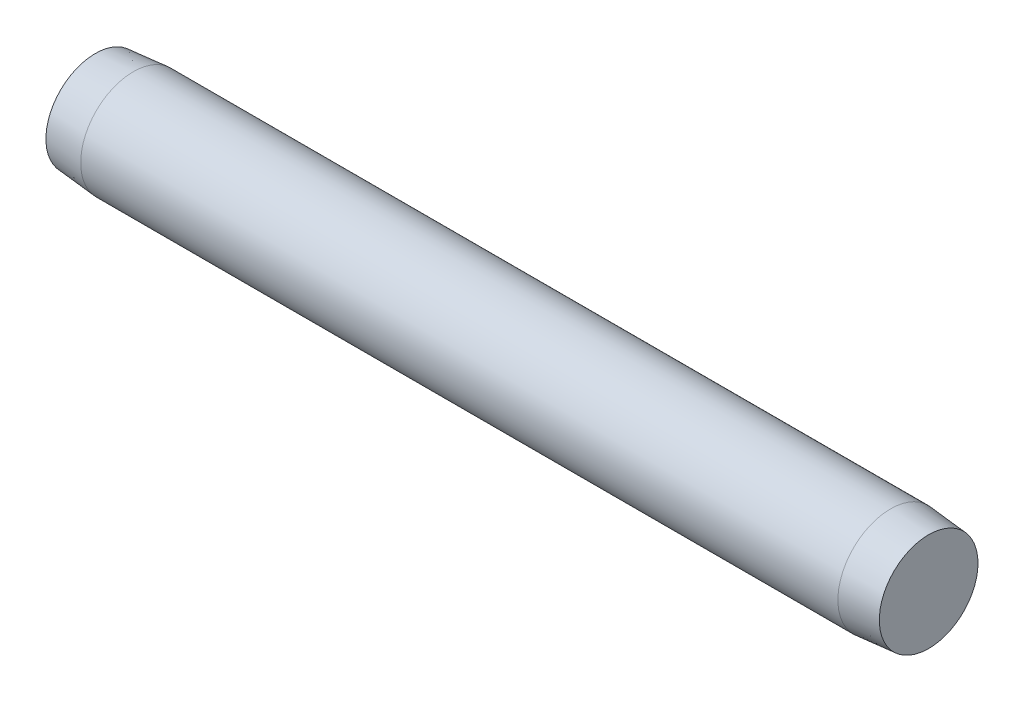
ISO-10303-21;
HEADER;
FILE_DESCRIPTION(('STEP AP214'),'2;1');
FILE_NAME('part.step','',(''),(''),'','','');
FILE_SCHEMA(('AUTOMOTIVE_DESIGN { 1 0 10303 214 1 1 1 1 }'));
ENDSEC;
DATA;
#1=APPLICATION_CONTEXT('core data for automotive mechanical design processes');
#2=APPLICATION_PROTOCOL_DEFINITION('international standard','automotive_design',2000,#1);
#3=PRODUCT_CONTEXT('',#1,'mechanical');
#4=PRODUCT('Part','Part','',(#3));
#5=PRODUCT_RELATED_PRODUCT_CATEGORY('part','',(#4));
#6=PRODUCT_DEFINITION_FORMATION('','',#4);
#7=PRODUCT_DEFINITION_CONTEXT('part definition',#1,'design');
#8=PRODUCT_DEFINITION('design','',#6,#7);
#9=PRODUCT_DEFINITION_SHAPE('','',#8);
#10=(LENGTH_UNIT() NAMED_UNIT(*) SI_UNIT(.MILLI.,.METRE.));
#11=(NAMED_UNIT(*) PLANE_ANGLE_UNIT() SI_UNIT($,.RADIAN.));
#12=(NAMED_UNIT(*) SI_UNIT($,.STERADIAN.) SOLID_ANGLE_UNIT());
#13=UNCERTAINTY_MEASURE_WITH_UNIT(LENGTH_MEASURE(1.E-05),#10,'distance_accuracy_value','');
#14=(GEOMETRIC_REPRESENTATION_CONTEXT(3) GLOBAL_UNCERTAINTY_ASSIGNED_CONTEXT((#13)) GLOBAL_UNIT_ASSIGNED_CONTEXT((#10,
#11,#12)) REPRESENTATION_CONTEXT('',''));
#15=CARTESIAN_POINT('',(0.,0.,0.));
#16=DIRECTION('',(0.,0.,1.));
#17=DIRECTION('',(1.,0.,0.));
#18=AXIS2_PLACEMENT_3D('',#15,#16,#17);
#19=CARTESIAN_POINT('',(25.,0.,0.));
#20=DIRECTION('',(-1.,0.,0.));
#21=DIRECTION('',(0.,0.,1.));
#22=AXIS2_PLACEMENT_3D('',#19,#20,#21);
#23=CYLINDRICAL_SURFACE('',#22,1.58);
#24=CARTESIAN_POINT('',(23.8569947697237,0.,0.));
#25=DIRECTION('',(1.,0.,0.));
#26=DIRECTION('',(0.,0.,-1.));
#27=AXIS2_PLACEMENT_3D('',#24,#25,#26);
#28=CIRCLE('',#27,1.58);
#29=CARTESIAN_POINT('',(23.8569947697237,0.,-1.58));
#30=VERTEX_POINT('',#29);
#31=EDGE_CURVE('E10',#30,#30,#28,.F.);
#32=ORIENTED_EDGE('',*,*,#31,.T.);
#33=EDGE_LOOP('',(#32));
#34=FACE_BOUND('',#33,.T.);
#35=CARTESIAN_POINT('',(1.14300523027611,0.,0.));
#36=DIRECTION('',(1.,0.,0.));
#37=DIRECTION('',(0.,0.,-1.));
#38=AXIS2_PLACEMENT_3D('',#35,#36,#37);
#39=CIRCLE('',#38,1.58);
#40=CARTESIAN_POINT('',(1.14300523027611,0.,-1.58));
#41=VERTEX_POINT('',#40);
#42=EDGE_CURVE('E57',#41,#41,#39,.T.);
#43=ORIENTED_EDGE('',*,*,#42,.T.);
#44=EDGE_LOOP('',(#43));
#45=FACE_BOUND('',#44,.T.);
#46=ADVANCED_FACE('F41',(#34,#45),#23,.T.);
#47=CARTESIAN_POINT('',(25.,0.,0.));
#48=DIRECTION('',(1.,0.,0.));
#49=DIRECTION('',(0.,0.,-1.));
#50=AXIS2_PLACEMENT_3D('',#47,#48,#49);
#51=PLANE('',#50);
#52=CARTESIAN_POINT('',(25.,0.,0.));
#53=DIRECTION('',(1.,0.,0.));
#54=DIRECTION('',(0.,0.,-1.));
#55=AXIS2_PLACEMENT_3D('',#52,#53,#54);
#56=CIRCLE('',#55,1.47999999999999);
#57=CARTESIAN_POINT('',(25.,0.,-1.47999999999999));
#58=VERTEX_POINT('',#57);
#59=EDGE_CURVE('E49',#58,#58,#56,.T.);
#60=ORIENTED_EDGE('',*,*,#59,.T.);
#61=EDGE_LOOP('',(#60));
#62=FACE_BOUND('',#61,.T.);
#63=ADVANCED_FACE('F73',(#62),#51,.T.);
#64=CARTESIAN_POINT('',(0.,0.,0.));
#65=DIRECTION('',(1.,0.,0.));
#66=DIRECTION('',(0.,0.,-1.));
#67=AXIS2_PLACEMENT_3D('',#64,#65,#66);
#68=PLANE('',#67);
#69=CARTESIAN_POINT('',(0.,0.,0.));
#70=DIRECTION('',(1.,0.,0.));
#71=DIRECTION('',(0.,0.,-1.));
#72=AXIS2_PLACEMENT_3D('',#69,#70,#71);
#73=CIRCLE('',#72,1.48);
#74=CARTESIAN_POINT('',(0.,0.,-1.48));
#75=VERTEX_POINT('',#74);
#76=EDGE_CURVE('E53',#75,#75,#73,.F.);
#77=ORIENTED_EDGE('',*,*,#76,.T.);
#78=EDGE_LOOP('',(#77));
#79=FACE_BOUND('',#78,.T.);
#80=ADVANCED_FACE('F66',(#79),#68,.F.);
#81=CARTESIAN_POINT('',(1.14300523027611,0.,0.));
#82=DIRECTION('',(1.,0.,0.));
#83=DIRECTION('',(0.,0.,-1.));
#84=AXIS2_PLACEMENT_3D('',#81,#82,#83);
#85=CONICAL_SURFACE('',#84,1.58,0.0872664625997172);
#86=ORIENTED_EDGE('',*,*,#76,.F.);
#87=EDGE_LOOP('',(#86));
#88=FACE_BOUND('',#87,.T.);
#89=ORIENTED_EDGE('',*,*,#42,.F.);
#90=EDGE_LOOP('',(#89));
#91=FACE_BOUND('',#90,.T.);
#92=ADVANCED_FACE('F64',(#88,#91),#85,.T.);
#93=CARTESIAN_POINT('',(25.,0.,0.));
#94=DIRECTION('',(-1.,0.,0.));
#95=DIRECTION('',(0.,0.,1.));
#96=AXIS2_PLACEMENT_3D('',#93,#94,#95);
#97=CONICAL_SURFACE('',#96,1.47999999999999,0.0872664625997134);
#98=ORIENTED_EDGE('',*,*,#31,.F.);
#99=EDGE_LOOP('',(#98));
#100=FACE_BOUND('',#99,.T.);
#101=ORIENTED_EDGE('',*,*,#59,.F.);
#102=EDGE_LOOP('',(#101));
#103=FACE_BOUND('',#102,.T.);
#104=ADVANCED_FACE('F44',(#100,#103),#97,.T.);
#105=CLOSED_SHELL('',(#46,#63,#80,#92,#104));
#106=MANIFOLD_SOLID_BREP('B2',#105);
#107=ADVANCED_BREP_SHAPE_REPRESENTATION('',(#18,#106),#14);
#108=SHAPE_DEFINITION_REPRESENTATION(#9,#107);
ENDSEC;
END-ISO-10303-21;
